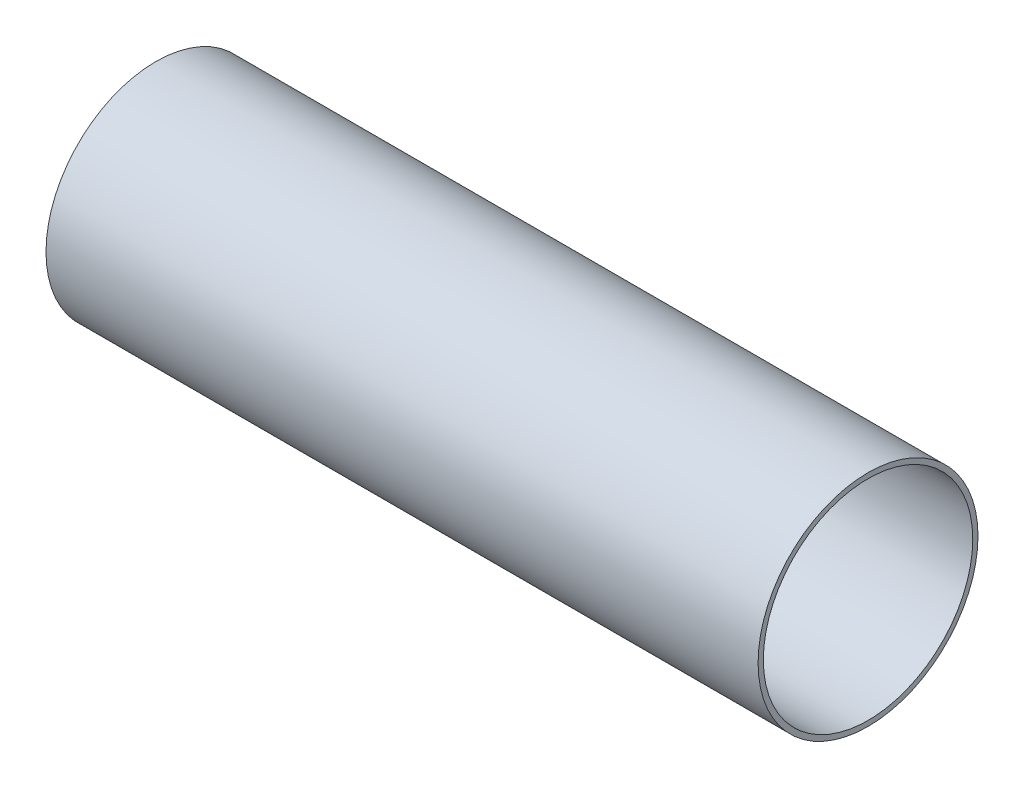
ISO-10303-21;
HEADER;
FILE_DESCRIPTION(('STEP AP214'),'2;1');
FILE_NAME('part.step','',(''),(''),'','','');
FILE_SCHEMA(('AUTOMOTIVE_DESIGN { 1 0 10303 214 1 1 1 1 }'));
ENDSEC;
DATA;
#1=APPLICATION_CONTEXT('core data for automotive mechanical design processes');
#2=APPLICATION_PROTOCOL_DEFINITION('international standard','automotive_design',2000,#1);
#3=PRODUCT_CONTEXT('',#1,'mechanical');
#4=PRODUCT('Part','Part','',(#3));
#5=PRODUCT_RELATED_PRODUCT_CATEGORY('part','',(#4));
#6=PRODUCT_DEFINITION_FORMATION('','',#4);
#7=PRODUCT_DEFINITION_CONTEXT('part definition',#1,'design');
#8=PRODUCT_DEFINITION('design','',#6,#7);
#9=PRODUCT_DEFINITION_SHAPE('','',#8);
#10=(LENGTH_UNIT() NAMED_UNIT(*) SI_UNIT(.MILLI.,.METRE.));
#11=(NAMED_UNIT(*) PLANE_ANGLE_UNIT() SI_UNIT($,.RADIAN.));
#12=(NAMED_UNIT(*) SI_UNIT($,.STERADIAN.) SOLID_ANGLE_UNIT());
#13=UNCERTAINTY_MEASURE_WITH_UNIT(LENGTH_MEASURE(1.E-05),#10,'distance_accuracy_value','');
#14=(GEOMETRIC_REPRESENTATION_CONTEXT(3) GLOBAL_UNCERTAINTY_ASSIGNED_CONTEXT((#13)) GLOBAL_UNIT_ASSIGNED_CONTEXT((#10,
#11,#12)) REPRESENTATION_CONTEXT('',''));
#15=CARTESIAN_POINT('',(0.,0.,0.));
#16=DIRECTION('',(0.,0.,1.));
#17=DIRECTION('',(1.,0.,0.));
#18=AXIS2_PLACEMENT_3D('',#15,#16,#17);
#19=CARTESIAN_POINT('',(431.8,0.,0.));
#20=DIRECTION('',(1.,0.,0.));
#21=DIRECTION('',(0.,0.,-1.));
#22=AXIS2_PLACEMENT_3D('',#19,#20,#21);
#23=PLANE('',#22);
#24=CARTESIAN_POINT('',(431.8,0.,0.));
#25=DIRECTION('',(1.,0.,0.));
#26=DIRECTION('',(0.,0.,-1.));
#27=AXIS2_PLACEMENT_3D('',#24,#25,#26);
#28=CIRCLE('',#27,66.675);
#29=CARTESIAN_POINT('',(431.8,0.,-66.675));
#30=VERTEX_POINT('',#29);
#31=EDGE_CURVE('E10',#30,#30,#28,.T.);
#32=ORIENTED_EDGE('',*,*,#31,.T.);
#33=EDGE_LOOP('',(#32));
#34=FACE_BOUND('',#33,.T.);
#35=CARTESIAN_POINT('',(431.8,0.,0.));
#36=DIRECTION('',(1.,0.,0.));
#37=DIRECTION('',(0.,0.,-1.));
#38=AXIS2_PLACEMENT_3D('',#35,#36,#37);
#39=CIRCLE('',#38,63.5);
#40=CARTESIAN_POINT('',(431.8,0.,-63.5));
#41=VERTEX_POINT('',#40);
#42=EDGE_CURVE('E57',#41,#41,#39,.T.);
#43=ORIENTED_EDGE('',*,*,#42,.F.);
#44=EDGE_LOOP('',(#43));
#45=FACE_BOUND('',#44,.T.);
#46=ADVANCED_FACE('F43',(#34,#45),#23,.T.);
#47=CARTESIAN_POINT('',(0.,0.,0.));
#48=DIRECTION('',(1.,0.,0.));
#49=DIRECTION('',(0.,0.,-1.));
#50=AXIS2_PLACEMENT_3D('',#47,#48,#49);
#51=PLANE('',#50);
#52=CARTESIAN_POINT('',(0.,0.,0.));
#53=DIRECTION('',(1.,0.,0.));
#54=DIRECTION('',(0.,0.,-1.));
#55=AXIS2_PLACEMENT_3D('',#52,#53,#54);
#56=CIRCLE('',#55,66.675);
#57=CARTESIAN_POINT('',(0.,0.,-66.675));
#58=VERTEX_POINT('',#57);
#59=EDGE_CURVE('E50',#58,#58,#56,.T.);
#60=ORIENTED_EDGE('',*,*,#59,.F.);
#61=EDGE_LOOP('',(#60));
#62=FACE_BOUND('',#61,.T.);
#63=CARTESIAN_POINT('',(0.,0.,0.));
#64=DIRECTION('',(1.,0.,0.));
#65=DIRECTION('',(0.,0.,-1.));
#66=AXIS2_PLACEMENT_3D('',#63,#64,#65);
#67=CIRCLE('',#66,63.5);
#68=CARTESIAN_POINT('',(0.,0.,-63.5));
#69=VERTEX_POINT('',#68);
#70=EDGE_CURVE('E59',#69,#69,#67,.T.);
#71=ORIENTED_EDGE('',*,*,#70,.T.);
#72=EDGE_LOOP('',(#71));
#73=FACE_BOUND('',#72,.T.);
#74=ADVANCED_FACE('F69',(#62,#73),#51,.F.);
#75=CARTESIAN_POINT('',(431.8,0.,0.));
#76=DIRECTION('',(-1.,0.,0.));
#77=DIRECTION('',(0.,0.,1.));
#78=AXIS2_PLACEMENT_3D('',#75,#76,#77);
#79=CYLINDRICAL_SURFACE('',#78,66.675);
#80=ORIENTED_EDGE('',*,*,#31,.F.);
#81=EDGE_LOOP('',(#80));
#82=FACE_BOUND('',#81,.T.);
#83=ORIENTED_EDGE('',*,*,#59,.T.);
#84=EDGE_LOOP('',(#83));
#85=FACE_BOUND('',#84,.T.);
#86=ADVANCED_FACE('F44',(#82,#85),#79,.T.);
#87=CARTESIAN_POINT('',(431.8,0.,0.));
#88=DIRECTION('',(-1.,0.,0.));
#89=DIRECTION('',(0.,0.,1.));
#90=AXIS2_PLACEMENT_3D('',#87,#88,#89);
#91=CYLINDRICAL_SURFACE('',#90,63.5);
#92=ORIENTED_EDGE('',*,*,#42,.T.);
#93=EDGE_LOOP('',(#92));
#94=FACE_BOUND('',#93,.T.);
#95=ORIENTED_EDGE('',*,*,#70,.F.);
#96=EDGE_LOOP('',(#95));
#97=FACE_BOUND('',#96,.T.);
#98=ADVANCED_FACE('F68',(#94,#97),#91,.F.);
#99=CLOSED_SHELL('',(#46,#74,#86,#98));
#100=MANIFOLD_SOLID_BREP('B2',#99);
#101=ADVANCED_BREP_SHAPE_REPRESENTATION('',(#18,#100),#14);
#102=SHAPE_DEFINITION_REPRESENTATION(#9,#101);
ENDSEC;
END-ISO-10303-21;
